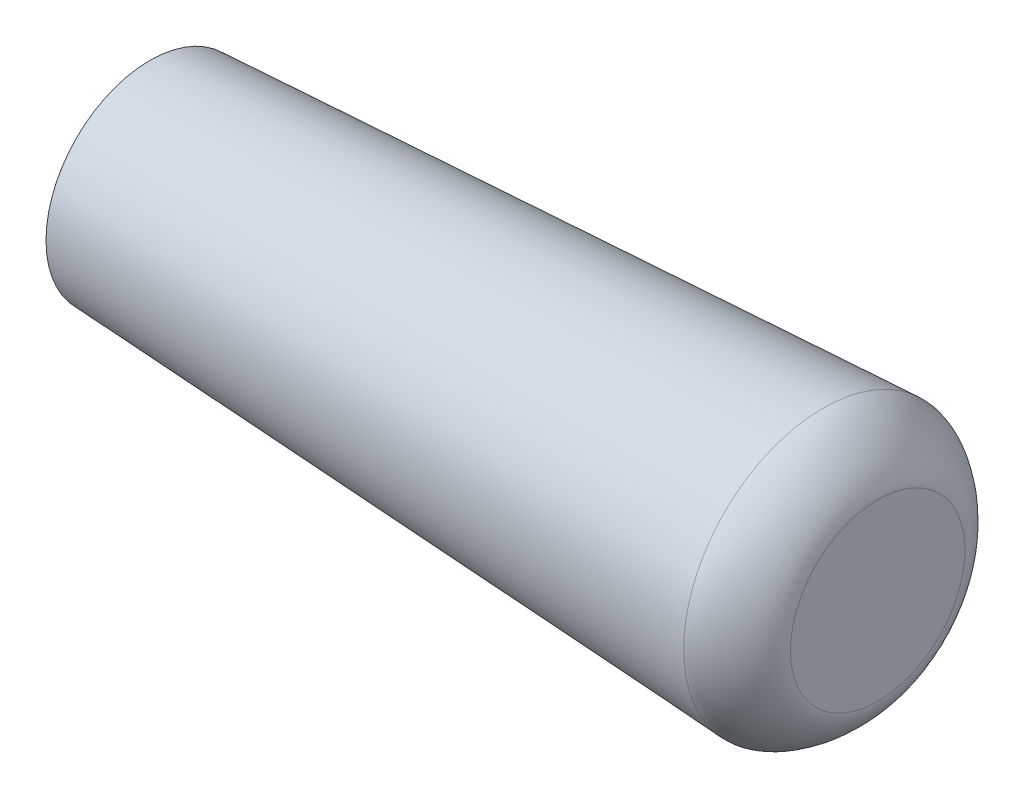
ISO-10303-21;
HEADER;
FILE_DESCRIPTION(('STEP AP214'),'2;1');
FILE_NAME('part.step','',(''),(''),'','','');
FILE_SCHEMA(('AUTOMOTIVE_DESIGN { 1 0 10303 214 1 1 1 1 }'));
ENDSEC;
DATA;
#1=APPLICATION_CONTEXT('core data for automotive mechanical design processes');
#2=APPLICATION_PROTOCOL_DEFINITION('international standard','automotive_design',2000,#1);
#3=PRODUCT_CONTEXT('',#1,'mechanical');
#4=PRODUCT('Part','Part','',(#3));
#5=PRODUCT_RELATED_PRODUCT_CATEGORY('part','',(#4));
#6=PRODUCT_DEFINITION_FORMATION('','',#4);
#7=PRODUCT_DEFINITION_CONTEXT('part definition',#1,'design');
#8=PRODUCT_DEFINITION('design','',#6,#7);
#9=PRODUCT_DEFINITION_SHAPE('','',#8);
#10=(LENGTH_UNIT() NAMED_UNIT(*) SI_UNIT(.MILLI.,.METRE.));
#11=(NAMED_UNIT(*) PLANE_ANGLE_UNIT() SI_UNIT($,.RADIAN.));
#12=(NAMED_UNIT(*) SI_UNIT($,.STERADIAN.) SOLID_ANGLE_UNIT());
#13=UNCERTAINTY_MEASURE_WITH_UNIT(LENGTH_MEASURE(1.E-05),#10,'distance_accuracy_value','');
#14=(GEOMETRIC_REPRESENTATION_CONTEXT(3) GLOBAL_UNCERTAINTY_ASSIGNED_CONTEXT((#13)) GLOBAL_UNIT_ASSIGNED_CONTEXT((#10,
#11,#12)) REPRESENTATION_CONTEXT('',''));
#15=CARTESIAN_POINT('',(0.,0.,0.));
#16=DIRECTION('',(0.,0.,1.));
#17=DIRECTION('',(1.,0.,0.));
#18=AXIS2_PLACEMENT_3D('',#15,#16,#17);
#19=CARTESIAN_POINT('',(0.,0.,0.));
#20=DIRECTION('',(1.,0.,0.));
#21=DIRECTION('',(0.,0.,1.));
#22=AXIS2_PLACEMENT_3D('',#19,#20,#21);
#23=CONICAL_SURFACE('',#22,10.,0.05235987755983);
#24=CARTESIAN_POINT('',(64.7383202187853,0.,13.3927915971809));
#25=CARTESIAN_POINT('',(64.7383202187853,-1.75311231639023,13.3927915971809));
#26=CARTESIAN_POINT('',(64.7383202187853,-3.50553487005225,13.0442130783827));
#27=CARTESIAN_POINT('',(64.7383202187853,-6.74486404466686,11.7024390012665));
#28=CARTESIAN_POINT('',(64.7383202187853,-8.23049615028417,10.7097713644856));
#29=CARTESIAN_POINT('',(64.7383202187853,-10.7097713644856,8.2304961502841));
#30=CARTESIAN_POINT('',(64.7383202187852,-11.7024390012669,6.74486404466601));
#31=CARTESIAN_POINT('',(64.7383202187853,-13.0442130783824,3.50553487005303));
#32=CARTESIAN_POINT('',(64.7383202187853,-13.3927915971809,1.75311231639051));
#33=CARTESIAN_POINT('',(64.7383202187853,-13.392791597181,-1.75311231639046));
#34=CARTESIAN_POINT('',(64.7383202187852,-13.0442130783824,-3.50553487005293));
#35=CARTESIAN_POINT('',(64.7383202187853,-11.7024390012668,-6.74486404466618));
#36=CARTESIAN_POINT('',(64.7383202187853,-10.7097713644862,-8.23049615028351));
#37=CARTESIAN_POINT('',(64.7383202187852,-8.23049615028352,-10.7097713644862));
#38=CARTESIAN_POINT('',(64.7383202187852,-6.74486404466627,-11.7024390012668));
#39=CARTESIAN_POINT('',(64.7383202187853,-3.50553487005277,-13.0442130783825));
#40=CARTESIAN_POINT('',(64.7383202187853,-1.75311231639048,-13.3927915971809));
#41=CARTESIAN_POINT('',(64.7383202187853,1.75311231639048,-13.3927915971809));
#42=CARTESIAN_POINT('',(64.7383202187853,3.50553487005314,-13.0442130783824));
#43=CARTESIAN_POINT('',(64.7383202187853,6.74486404466597,-11.7024390012669));
#44=CARTESIAN_POINT('',(64.7383202187852,8.23049615028302,-10.7097713644867));
#45=CARTESIAN_POINT('',(64.7383202187853,10.7097713644867,-8.23049615028305));
#46=CARTESIAN_POINT('',(64.7383202187853,11.7024390012669,-6.74486404466586));
#47=CARTESIAN_POINT('',(64.7383202187853,13.0442130783823,-3.50553487005322));
#48=CARTESIAN_POINT('',(64.7383202187853,13.3927915971809,-1.75311231639048));
#49=CARTESIAN_POINT('',(64.7383202187853,13.3927915971809,1.75311231639048));
#50=CARTESIAN_POINT('',(64.7383202187853,13.0442130783825,3.50553487005281));
#51=CARTESIAN_POINT('',(64.7383202187853,11.7024390012668,6.74486404466626));
#52=CARTESIAN_POINT('',(64.7383202187853,10.7097713644864,8.23049615028331));
#53=CARTESIAN_POINT('',(64.7383202187852,8.23049615028331,10.7097713644864));
#54=CARTESIAN_POINT('',(64.7383202187854,6.74486404466599,11.7024390012669));
#55=CARTESIAN_POINT('',(64.7383202187852,3.50553487005309,13.0442130783824));
#56=CARTESIAN_POINT('',(64.7383202187853,1.75311231639022,13.3927915971809));
#57=CARTESIAN_POINT('',(64.7383202187853,0.,13.3927915971809));
#58=(BOUNDED_CURVE() B_SPLINE_CURVE(3,(#24,#25,#26,#27,#28,#29,#30,#31,#32,#33,#34,#35,#36,#37,
#38,#39,#40,#41,#42,#43,#44,#45,#46,#47,#48,#49,#50,#51,#52,#53,#54,#55,#56,#57),.UNSPECIFIED.,
.T.,.F.) B_SPLINE_CURVE_WITH_KNOTS((4,2,2,2,2,2,2,2,2,2,2,2,2,2,2,2,4),(0.,0.392699081698725,
0.785398163397448,1.17809724509617,1.5707963267949,1.96349540849362,2.35619449019234,
2.74889357189107,3.14159265358979,3.53429173528852,3.92699081698724,4.31968989868597,
4.71238898038469,5.10508806208341,5.49778714378214,5.89048622548086,6.28318530717959),
.UNSPECIFIED.) CURVE() GEOMETRIC_REPRESENTATION_ITEM() RATIONAL_B_SPLINE_CURVE((0.999999999999998,
0.999999999999998,0.999999999999998,0.999999999999998,0.999999999999998,0.999999999999998,
0.999999999999998,0.999999999999998,0.999999999999998,0.999999999999998,0.999999999999998,
0.999999999999998,0.999999999999998,0.999999999999998,0.999999999999998,0.999999999999998,
0.999999999999998,0.999999999999998,0.999999999999998,0.999999999999998,0.999999999999998,
0.999999999999998,0.999999999999998,0.999999999999998,0.999999999999998,0.999999999999998,
0.999999999999998,0.999999999999998,0.999999999999998,0.999999999999998,0.999999999999998,
0.999999999999998,0.999999999999998,0.999999999999998)) REPRESENTATION_ITEM(''));
#59=CARTESIAN_POINT('',(64.7383202187853,0.,13.3927915971809));
#60=VERTEX_POINT('',#59);
#61=EDGE_CURVE('E12',#60,#60,#58,.T.);
#62=ORIENTED_EDGE('',*,*,#61,.F.);
#63=EDGE_LOOP('',(#62));
#64=FACE_BOUND('',#63,.T.);
#65=CARTESIAN_POINT('',(0.,0.,0.));
#66=DIRECTION('',(-1.,0.,0.));
#67=DIRECTION('',(0.,0.,1.));
#68=AXIS2_PLACEMENT_3D('',#65,#66,#67);
#69=CIRCLE('',#68,10.);
#70=CARTESIAN_POINT('',(0.,0.,10.));
#71=VERTEX_POINT('',#70);
#72=EDGE_CURVE('E114',#71,#71,#69,.T.);
#73=ORIENTED_EDGE('',*,*,#72,.F.);
#74=EDGE_LOOP('',(#73));
#75=FACE_BOUND('',#74,.T.);
#76=ADVANCED_FACE('F40',(#64,#75),#23,.T.);
#77=CARTESIAN_POINT('',(70.,0.,0.));
#78=DIRECTION('',(1.,0.,0.));
#79=DIRECTION('',(0.,0.,1.));
#80=AXIS2_PLACEMENT_3D('',#77,#78,#79);
#81=PLANE('',#80);
#82=CARTESIAN_POINT('',(70.,0.,8.39964392340808));
#83=CARTESIAN_POINT('',(70.,0.137435809831807,8.3996441457771));
#84=CARTESIAN_POINT('',(70.,0.274868870852457,8.39622814788783));
#85=CARTESIAN_POINT('',(70.,0.549397911011147,8.38262851954588));
#86=CARTESIAN_POINT('',(70.,0.686493895561294,8.3724449984744));
#87=CARTESIAN_POINT('',(70.,0.960024129648364,8.34537488336716));
#88=CARTESIAN_POINT('',(70.,1.09645836720264,8.32848816840796));
#89=CARTESIAN_POINT('',(70.,1.36834237689593,8.2880761814516));
#90=CARTESIAN_POINT('',(70.,1.50379213160251,8.26455079219447));
#91=CARTESIAN_POINT('',(70.,1.7733838936348,8.21092566212976));
#92=CARTESIAN_POINT('',(70.,1.90752590096051,8.18082592132217));
#93=CARTESIAN_POINT('',(70.,2.17417901936719,8.11411619101772));
#94=CARTESIAN_POINT('',(70.,2.30669015921437,8.07750631652697));
#95=CARTESIAN_POINT('',(70.,2.56975823142954,7.99784046985379));
#96=CARTESIAN_POINT('',(70.,2.70031519900863,7.95478461397196));
#97=CARTESIAN_POINT('',(70.,2.95915205255988,7.86229088127508));
#98=CARTESIAN_POINT('',(70.,3.08743190169454,7.81285290132167));
#99=CARTESIAN_POINT('',(70.,3.34137723281421,7.70766530111738));
#100=CARTESIAN_POINT('',(70.,3.46704271479922,7.6519156808665));
#101=CARTESIAN_POINT('',(70.,3.71547095494232,7.5342933318498));
#102=CARTESIAN_POINT('',(70.,3.83823375998218,7.47242070206187));
#103=CARTESIAN_POINT('',(70.,4.08058323746257,7.34273574564432));
#104=CARTESIAN_POINT('',(70.,4.20016985256415,7.27492331187979));
#105=CARTESIAN_POINT('',(70.,4.43589298614747,7.13354198276467));
#106=CARTESIAN_POINT('',(70.,4.55202944364848,7.05997298575159));
#107=CARTESIAN_POINT('',(70.,4.78057828989615,6.90726152896813));
#108=CARTESIAN_POINT('',(70.,4.89299067864281,6.82811906919775));
#109=CARTESIAN_POINT('',(70.,5.11381733273933,6.66444358303719));
#110=CARTESIAN_POINT('',(70.,5.22223166867676,6.5799106518904));
#111=CARTESIAN_POINT('',(70.,5.43478807545815,6.40563721418535));
#112=CARTESIAN_POINT('',(70.,5.53893022333921,6.31589680160012));
#113=CARTESIAN_POINT('',(70.,5.74266847580178,6.13139115945657));
#114=CARTESIAN_POINT('',(70.,5.84226450688053,6.03662584870793));
#115=CARTESIAN_POINT('',(70.,6.03662584870793,5.84226450688054));
#116=CARTESIAN_POINT('',(70.,6.13139115945656,5.74266847580178));
#117=CARTESIAN_POINT('',(70.,6.3158968016001,5.5389302233392));
#118=CARTESIAN_POINT('',(70.,6.40563721418532,5.43478807545814));
#119=CARTESIAN_POINT('',(70.,6.57991065189037,5.22223166867678));
#120=CARTESIAN_POINT('',(70.,6.66444358303715,5.11381733273938));
#121=CARTESIAN_POINT('',(70.,6.82811906919769,4.89299067864275));
#122=CARTESIAN_POINT('',(70.,6.90726152896804,4.78057828989593));
#123=CARTESIAN_POINT('',(70.,7.05997298575154,4.55202944364869));
#124=CARTESIAN_POINT('',(70.,7.1335419827647,4.43589298614827));
#125=CARTESIAN_POINT('',(70.,7.27492331187959,4.20016985256333));
#126=CARTESIAN_POINT('',(70.,7.34273574564381,4.08058323745954));
#127=CARTESIAN_POINT('',(70.,7.47242070206222,3.8382337599852));
#128=CARTESIAN_POINT('',(70.,7.53429333185132,3.71547095495361));
#129=CARTESIAN_POINT('',(70.,7.65191568086488,3.46704271478792));
#130=CARTESIAN_POINT('',(70.,7.70766530111145,3.34137723277203));
#131=CARTESIAN_POINT('',(70.,7.8128529013276,3.08743190173671));
#132=CARTESIAN_POINT('',(70.,7.86229088129717,2.95915205271727));
#133=CARTESIAN_POINT('',(70.,7.95478461394999,2.70031519885127));
#134=CARTESIAN_POINT('',(70.,7.99784046977158,2.56975823084222));
#135=CARTESIAN_POINT('',(70.,8.07750631660936,2.30669015980175));
#136=CARTESIAN_POINT('',(70.,8.11411619132496,2.17417902155926));
#137=CARTESIAN_POINT('',(70.,8.18082592101511,1.90752589876849));
#138=CARTESIAN_POINT('',(70.,8.21092566098354,1.77338388545386));
#139=CARTESIAN_POINT('',(70.,8.26455079334083,1.50379213978357));
#140=CARTESIAN_POINT('',(70.,8.28807618572969,1.36834240742791));
#141=CARTESIAN_POINT('',(70.,8.32848816413004,1.09645833667133));
#142=CARTESIAN_POINT('',(70.,8.34537486740175,0.960024015704698));
#143=CARTESIAN_POINT('',(70.,8.37244501443957,0.686494009503035));
#144=CARTESIAN_POINT('',(70.,8.38262857912812,0.549398336243527));
#145=CARTESIAN_POINT('',(70.,8.39622808830464,0.27486844561329));
#146=CARTESIAN_POINT('',(70.,8.39964392340808,0.137434222806645));
#147=CARTESIAN_POINT('',(70.,8.39964392340808,-0.137434222806648));
#148=CARTESIAN_POINT('',(70.,8.39622808830464,-0.274868445613296));
#149=CARTESIAN_POINT('',(70.,8.38262857912812,-0.549398336243544));
#150=CARTESIAN_POINT('',(70.,8.37244501443957,-0.68649400950306));
#151=CARTESIAN_POINT('',(70.,8.34537486740175,-0.96002401570474));
#152=CARTESIAN_POINT('',(70.,8.32848816413004,-1.09645833667138));
#153=CARTESIAN_POINT('',(70.,8.28807618572969,-1.36834240742798));
#154=CARTESIAN_POINT('',(70.,8.26455079334083,-1.50379213978365));
#155=CARTESIAN_POINT('',(70.,8.21092566098354,-1.77338388545395));
#156=CARTESIAN_POINT('',(70.,8.18082592101511,-1.90752589876858));
#157=CARTESIAN_POINT('',(70.,8.11411619132495,-2.17417902155936));
#158=CARTESIAN_POINT('',(70.,8.07750631660936,-2.30669015980186));
#159=CARTESIAN_POINT('',(70.,7.99784046977158,-2.56975823084232));
#160=CARTESIAN_POINT('',(70.,7.95478461394998,-2.70031519885136));
#161=CARTESIAN_POINT('',(70.,7.86229088129717,-2.95915205271732));
#162=CARTESIAN_POINT('',(70.,7.8128529013276,-3.08743190173674));
#163=CARTESIAN_POINT('',(70.,7.70766530111145,-3.34137723277202));
#164=CARTESIAN_POINT('',(70.,7.65191568086488,-3.46704271478788));
#165=CARTESIAN_POINT('',(70.,7.53429333185133,-3.71547095495355));
#166=CARTESIAN_POINT('',(70.,7.47242070206223,-3.83823375998514));
#167=CARTESIAN_POINT('',(70.,7.34273574564385,-4.08058323745949));
#168=CARTESIAN_POINT('',(70.,7.27492331187964,-4.20016985256329));
#169=CARTESIAN_POINT('',(70.,7.13354198276477,-4.43589298614825));
#170=CARTESIAN_POINT('',(70.,7.05997298575162,-4.55202944364868));
#171=CARTESIAN_POINT('',(70.,6.90726152896813,-4.78057828989595));
#172=CARTESIAN_POINT('',(70.,6.82811906919778,-4.89299067864279));
#173=CARTESIAN_POINT('',(70.,6.66444358303725,-5.11381733273944));
#174=CARTESIAN_POINT('',(70.,6.57991065189047,-5.22223166867684));
#175=CARTESIAN_POINT('',(70.,6.40563721418542,-5.43478807545821));
#176=CARTESIAN_POINT('',(70.,6.31589680160019,-5.53893022333927));
#177=CARTESIAN_POINT('',(70.,6.13139115945661,-5.74266847580183));
#178=CARTESIAN_POINT('',(70.,6.03662584870795,-5.84226450688056));
#179=CARTESIAN_POINT('',(70.,5.84226450688051,-6.0366258487079));
#180=CARTESIAN_POINT('',(70.,5.74266847580173,-6.13139115945652));
#181=CARTESIAN_POINT('',(70.,5.5389302233391,-6.31589680160002));
#182=CARTESIAN_POINT('',(70.,5.43478807545802,-6.40563721418521));
#183=CARTESIAN_POINT('',(70.,5.22223166867663,-6.57991065189023));
#184=CARTESIAN_POINT('',(70.,5.11381733273923,-6.66444358303701));
#185=CARTESIAN_POINT('',(70.,4.89299067864259,-6.82811906919753));
#186=CARTESIAN_POINT('',(70.,4.78057828989576,-6.90726152896788));
#187=CARTESIAN_POINT('',(70.,4.55202944364853,-7.05997298575139));
#188=CARTESIAN_POINT('',(70.,4.43589298614812,-7.13354198276455));
#189=CARTESIAN_POINT('',(70.,4.20016985256319,-7.27492331187945));
#190=CARTESIAN_POINT('',(70.,4.08058323745941,-7.34273574564369));
#191=CARTESIAN_POINT('',(70.,3.8382337599851,-7.47242070206211));
#192=CARTESIAN_POINT('',(70.,3.71547095495353,-7.53429333185123));
#193=CARTESIAN_POINT('',(70.,3.46704271478788,-7.65191568086483));
#194=CARTESIAN_POINT('',(70.,3.34137723277202,-7.70766530111143));
#195=CARTESIAN_POINT('',(70.,3.08743190173675,-7.81285290132761));
#196=CARTESIAN_POINT('',(70.,2.95915205271733,-7.8622908812972));
#197=CARTESIAN_POINT('',(70.,2.70031519885136,-7.95478461395004));
#198=CARTESIAN_POINT('',(70.,2.56975823084233,-7.99784046977164));
#199=CARTESIAN_POINT('',(70.,2.30669015980186,-8.07750631660943));
#200=CARTESIAN_POINT('',(70.,2.17417902155937,-8.11411619132503));
#201=CARTESIAN_POINT('',(70.,1.90752589876858,-8.18082592101518));
#202=CARTESIAN_POINT('',(70.,1.77338388545395,-8.21092566098361));
#203=CARTESIAN_POINT('',(70.,1.50379213978365,-8.26455079334089));
#204=CARTESIAN_POINT('',(70.,1.36834240742798,-8.28807618572974));
#205=CARTESIAN_POINT('',(70.,1.09645833667138,-8.32848816413008));
#206=CARTESIAN_POINT('',(70.,0.96002401570474,-8.34537486740178));
#207=CARTESIAN_POINT('',(70.,0.686494009503061,-8.37244501443959));
#208=CARTESIAN_POINT('',(70.,0.549398336243545,-8.38262857912814));
#209=CARTESIAN_POINT('',(70.,0.274868445613297,-8.39622808830464));
#210=CARTESIAN_POINT('',(70.,0.137434222806649,-8.39964392340808));
#211=CARTESIAN_POINT('',(70.,-0.137434222806643,-8.39964392340808));
#212=CARTESIAN_POINT('',(70.,-0.274868445613288,-8.39622808830464));
#213=CARTESIAN_POINT('',(70.,-0.549398336243524,-8.38262857912814));
#214=CARTESIAN_POINT('',(70.,-0.686494009503031,-8.37244501443959));
#215=CARTESIAN_POINT('',(70.,-0.960024015704691,-8.34537486740178));
#216=CARTESIAN_POINT('',(70.,-1.09645833667132,-8.32848816413009));
#217=CARTESIAN_POINT('',(70.,-1.3683424074279,-8.28807618572975));
#218=CARTESIAN_POINT('',(70.,-1.50379213978356,-8.2645507933409));
#219=CARTESIAN_POINT('',(70.,-1.77338388545384,-8.21092566098361));
#220=CARTESIAN_POINT('',(70.,-1.90752589876847,-8.18082592101518));
#221=CARTESIAN_POINT('',(70.,-2.17417902155924,-8.11411619132503));
#222=CARTESIAN_POINT('',(70.,-2.30669015980174,-8.07750631660944));
#223=CARTESIAN_POINT('',(70.,-2.56975823084222,-7.99784046977165));
#224=CARTESIAN_POINT('',(70.,-2.70031519885126,-7.95478461395004));
#225=CARTESIAN_POINT('',(70.,-2.95915205271726,-7.86229088129721));
#226=CARTESIAN_POINT('',(70.,-3.0874319017367,-7.81285290132762));
#227=CARTESIAN_POINT('',(70.,-3.34137723277203,-7.70766530111144));
#228=CARTESIAN_POINT('',(70.,-3.46704271478791,-7.65191568086485));
#229=CARTESIAN_POINT('',(70.,-3.71547095495362,-7.53429333185127));
#230=CARTESIAN_POINT('',(70.,-3.83823375998522,-7.47242070206217));
#231=CARTESIAN_POINT('',(70.,-4.08058323745958,-7.34273574564378));
#232=CARTESIAN_POINT('',(70.,-4.20016985256339,-7.27492331187957));
#233=CARTESIAN_POINT('',(70.,-4.43589298614835,-7.1335419827647));
#234=CARTESIAN_POINT('',(70.,-4.55202944364877,-7.05997298575156));
#235=CARTESIAN_POINT('',(70.,-4.78057828989603,-6.90726152896807));
#236=CARTESIAN_POINT('',(70.,-4.89299067864286,-6.82811906919773));
#237=CARTESIAN_POINT('',(70.,-5.11381733273949,-6.66444358303722));
#238=CARTESIAN_POINT('',(70.,-5.22223166867689,-6.57991065189044));
#239=CARTESIAN_POINT('',(70.,-5.43478807545824,-6.4056372141854));
#240=CARTESIAN_POINT('',(70.,-5.53893022333929,-6.31589680160018));
#241=CARTESIAN_POINT('',(70.,-5.74266847580184,-6.13139115945661));
#242=CARTESIAN_POINT('',(70.,-5.84226450688057,-6.03662584870794));
#243=CARTESIAN_POINT('',(70.,-6.03662584870791,-5.8422645068805));
#244=CARTESIAN_POINT('',(70.,-6.13139115945652,-5.74266847580173));
#245=CARTESIAN_POINT('',(70.,-6.31589680160003,-5.53893022333913));
#246=CARTESIAN_POINT('',(70.,-6.40563721418525,-5.43478807545806));
#247=CARTESIAN_POINT('',(70.,-6.57991065189029,-5.22223166867671));
#248=CARTESIAN_POINT('',(70.,-6.66444358303708,-5.11381733273933));
#249=CARTESIAN_POINT('',(70.,-6.82811906919763,-4.89299067864272));
#250=CARTESIAN_POINT('',(70.,-6.90726152896799,-4.78057828989591));
#251=CARTESIAN_POINT('',(70.,-7.05997298575153,-4.55202944364871));
#252=CARTESIAN_POINT('',(70.,-7.1335419827647,-4.43589298614831));
#253=CARTESIAN_POINT('',(70.,-7.27492331187961,-4.20016985256339));
#254=CARTESIAN_POINT('',(70.,-7.34273574564384,-4.0805832374596));
#255=CARTESIAN_POINT('',(70.,-7.47242070206225,-3.83823375998527));
#256=CARTESIAN_POINT('',(70.,-7.53429333185136,-3.71547095495368));
#257=CARTESIAN_POINT('',(70.,-7.65191568086491,-3.46704271478797));
#258=CARTESIAN_POINT('',(70.,-7.70766530111147,-3.34137723277207));
#259=CARTESIAN_POINT('',(70.,-7.81285290132758,-3.0874319017367));
#260=CARTESIAN_POINT('',(70.,-7.86229088129713,-2.95915205271724));
#261=CARTESIAN_POINT('',(70.,-7.95478461394991,-2.7003151988512));
#262=CARTESIAN_POINT('',(70.,-7.9978404697715,-2.56975823084215));
#263=CARTESIAN_POINT('',(70.,-8.07750631660928,-2.30669015980166));
#264=CARTESIAN_POINT('',(70.,-8.11411619132488,-2.17417902155916));
#265=CARTESIAN_POINT('',(70.,-8.18082592101503,-1.90752589876839));
#266=CARTESIAN_POINT('',(70.,-8.21092566098347,-1.77338388545376));
#267=CARTESIAN_POINT('',(70.,-8.26455079334077,-1.50379213978349));
#268=CARTESIAN_POINT('',(70.,-8.28807618572964,-1.36834240742784));
#269=CARTESIAN_POINT('',(70.,-8.32848816413001,-1.09645833667127));
#270=CARTESIAN_POINT('',(70.,-8.34537486740172,-0.960024015704647));
#271=CARTESIAN_POINT('',(70.,-8.37244501443956,-0.686494009503));
#272=CARTESIAN_POINT('',(70.,-8.38262857912811,-0.549398336243498));
#273=CARTESIAN_POINT('',(70.,-8.39622808830464,-0.274868445613271));
#274=CARTESIAN_POINT('',(70.,-8.39964392340808,-0.137434222806629));
#275=CARTESIAN_POINT('',(70.,-8.39964392340808,0.137434222806661));
#276=CARTESIAN_POINT('',(70.,-8.39622808830464,0.274868445613309));
#277=CARTESIAN_POINT('',(70.,-8.38262857912814,0.549398336243556));
#278=CARTESIAN_POINT('',(70.,-8.3724450144396,0.686494009503071));
#279=CARTESIAN_POINT('',(70.,-8.34537486740181,0.960024015704749));
#280=CARTESIAN_POINT('',(70.,-8.32848816413012,1.09645833667139));
#281=CARTESIAN_POINT('',(70.,-8.28807618572979,1.36834240742799));
#282=CARTESIAN_POINT('',(70.,-8.26455079334094,1.50379213978365));
#283=CARTESIAN_POINT('',(70.,-8.21092566098367,1.77338388545395));
#284=CARTESIAN_POINT('',(70.,-8.18082592101524,1.90752589876858));
#285=CARTESIAN_POINT('',(70.,-8.1141161913251,2.17417902155936));
#286=CARTESIAN_POINT('',(70.,-8.0775063166095,2.30669015980186));
#287=CARTESIAN_POINT('',(70.,-7.99784046977171,2.56975823084232));
#288=CARTESIAN_POINT('',(70.,-7.9547846139501,2.70031519885135));
#289=CARTESIAN_POINT('',(70.,-7.86229088129724,2.95915205271731));
#290=CARTESIAN_POINT('',(70.,-7.81285290132764,3.08743190173673));
#291=CARTESIAN_POINT('',(70.,-7.70766530111142,3.34137723277201));
#292=CARTESIAN_POINT('',(70.,-7.65191568086481,3.46704271478787));
#293=CARTESIAN_POINT('',(70.,-7.53429333185119,3.71547095495356));
#294=CARTESIAN_POINT('',(70.,-7.47242070206207,3.83823375998516));
#295=CARTESIAN_POINT('',(70.,-7.34273574564364,4.08058323745954));
#296=CARTESIAN_POINT('',(70.,-7.27492331187941,4.20016985256336));
#297=CARTESIAN_POINT('',(70.,-7.13354198276452,4.43589298614836));
#298=CARTESIAN_POINT('',(70.,-7.05997298575136,4.55202944364881));
#299=CARTESIAN_POINT('',(70.,-6.90726152896786,4.7805782898961));
#300=CARTESIAN_POINT('',(70.,-6.82811906919752,4.89299067864295));
#301=CARTESIAN_POINT('',(70.,-6.66444358303701,5.11381733273961));
#302=CARTESIAN_POINT('',(70.,-6.57991065189024,5.22223166867701));
#303=CARTESIAN_POINT('',(70.,-6.40563721418524,5.43478807545835));
#304=CARTESIAN_POINT('',(70.,-6.31589680160004,5.5389302233394));
#305=CARTESIAN_POINT('',(70.,-6.13139115945654,5.74266847580189));
#306=CARTESIAN_POINT('',(70.,-6.03662584870793,5.84226450688058));
#307=CARTESIAN_POINT('',(70.,-5.84226450688057,6.03662584870784));
#308=CARTESIAN_POINT('',(70.,-5.74266847580183,6.13139115945641));
#309=CARTESIAN_POINT('',(70.,-5.5389302233393,6.31589680159987));
#310=CARTESIAN_POINT('',(70.,-5.43478807545826,6.40563721418506));
#311=CARTESIAN_POINT('',(70.,-5.2222316686769,6.57991065189008));
#312=CARTESIAN_POINT('',(70.,-5.11381733273948,6.66444358303687));
#313=CARTESIAN_POINT('',(70.,-4.89299067864298,6.82811906919744));
#314=CARTESIAN_POINT('',(70.,-4.78057828989632,6.90726152896784));
#315=CARTESIAN_POINT('',(70.,-4.55202944364865,7.05997298575134));
#316=CARTESIAN_POINT('',(70.,-4.43589298614764,7.13354198276445));
#317=CARTESIAN_POINT('',(70.,-4.20016985256431,7.27492331187962));
#318=CARTESIAN_POINT('',(70.,-4.08058323746272,7.34273574564418));
#319=CARTESIAN_POINT('',(70.,-3.8382337599823,7.47242070206178));
#320=CARTESIAN_POINT('',(70.,-3.71547095494242,7.53429333184974));
#321=CARTESIAN_POINT('',(70.,-3.46704271479928,7.65191568086648));
#322=CARTESIAN_POINT('',(70.,-3.34137723281424,7.70766530111737));
#323=CARTESIAN_POINT('',(70.,-3.08743190169453,7.81285290132167));
#324=CARTESIAN_POINT('',(70.,-2.95915205255985,7.86229088127508));
#325=CARTESIAN_POINT('',(70.,-2.70031519900857,7.95478461397196));
#326=CARTESIAN_POINT('',(70.,-2.56975823142947,7.9978404698538));
#327=CARTESIAN_POINT('',(70.,-2.30669015921429,8.07750631652698));
#328=CARTESIAN_POINT('',(70.,-2.17417901936709,8.11411619101773));
#329=CARTESIAN_POINT('',(70.,-1.90752590096042,8.18082592132218));
#330=CARTESIAN_POINT('',(70.,-1.77338389363471,8.21092566212977));
#331=CARTESIAN_POINT('',(70.,-1.50379213160243,8.26455079219448));
#332=CARTESIAN_POINT('',(70.,-1.36834237689586,8.2880761814516));
#333=CARTESIAN_POINT('',(70.,-1.09645836720259,8.32848816840797));
#334=CARTESIAN_POINT('',(70.,-0.960024129648323,8.34537488336716));
#335=CARTESIAN_POINT('',(70.,-0.686493895561272,8.3724449984744));
#336=CARTESIAN_POINT('',(70.,-0.549397911011132,8.38262851954588));
#337=CARTESIAN_POINT('',(70.,-0.274868870852451,8.39622814788783));
#338=CARTESIAN_POINT('',(70.,-0.137435809831803,8.3996441457771));
#339=CARTESIAN_POINT('',(70.,0.,8.39964392340808));
#340=B_SPLINE_CURVE_WITH_KNOTS('',3,(#82,#83,#84,#85,#86,#87,#88,#89,#90,#91,#92,#93,#94,#95,
#96,#97,#98,#99,#100,#101,#102,#103,#104,#105,#106,#107,#108,#109,#110,#111,#112,#113,#114,#115,
#116,#117,#118,#119,#120,#121,#122,#123,#124,#125,#126,#127,#128,#129,#130,#131,#132,#133,#134,
#135,#136,#137,#138,#139,#140,#141,#142,#143,#144,#145,#146,#147,#148,#149,#150,#151,#152,#153,
#154,#155,#156,#157,#158,#159,#160,#161,#162,#163,#164,#165,#166,#167,#168,#169,#170,#171,#172,
#173,#174,#175,#176,#177,#178,#179,#180,#181,#182,#183,#184,#185,#186,#187,#188,#189,#190,#191,
#192,#193,#194,#195,#196,#197,#198,#199,#200,#201,#202,#203,#204,#205,#206,#207,#208,#209,#210,
#211,#212,#213,#214,#215,#216,#217,#218,#219,#220,#221,#222,#223,#224,#225,#226,#227,#228,#229,
#230,#231,#232,#233,#234,#235,#236,#237,#238,#239,#240,#241,#242,#243,#244,#245,#246,#247,#248,
#249,#250,#251,#252,#253,#254,#255,#256,#257,#258,#259,#260,#261,#262,#263,#264,#265,#266,#267,
#268,#269,#270,#271,#272,#273,#274,#275,#276,#277,#278,#279,#280,#281,#282,#283,#284,#285,#286,
#287,#288,#289,#290,#291,#292,#293,#294,#295,#296,#297,#298,#299,#300,#301,#302,#303,#304,#305,
#306,#307,#308,#309,#310,#311,#312,#313,#314,#315,#316,#317,#318,#319,#320,#321,#322,#323,#324,
#325,#326,#327,#328,#329,#330,#331,#332,#333,#334,#335,#336,#337,#338,#339),.UNSPECIFIED.,.F.,
.F.,(4,2,2,2,2,2,2,2,2,2,2,2,2,2,2,2,2,2,2,2,2,2,2,2,2,2,2,2,2,2,2,2,2,2,2,2,2,2,2,2,2,2,2,2,2,
2,2,2,2,2,2,2,2,2,2,2,2,2,2,2,2,2,2,2,2,2,2,2,2,2,2,2,2,2,2,2,2,2,2,2,2,2,2,2,2,2,2,2,2,2,2,2,2,
2,2,2,2,2,2,2,2,2,2,2,2,2,2,2,2,2,2,2,2,2,2,2,2,2,2,2,2,2,2,2,2,2,2,2,4),(0.,0.412261089172174,
0.824515515269929,1.23677737864089,1.64904652431402,2.06131566998717,2.47357753335814,
2.88583195945594,3.29809304862817,3.71035413780038,4.12260856389814,4.53487042726907,
4.94713957294219,5.35940871861531,5.77167058198629,6.1839250080841,6.59618609725638,
7.00844718642866,7.42070161252647,7.83296347589743,8.24523262157054,8.65750176724365,
9.06976363061458,9.48201805671235,9.89427914588459,10.3065402350568,10.7187946611546,
11.1310565245256,11.5433256701987,11.9555948158718,12.3678566792428,12.7801111053406,
13.1923721945128,13.604633283685,14.0168877097828,14.4291495731538,14.8414187188269,
15.2536878645001,15.665949727871,16.0782041539688,16.490465243141,16.9027263323132,
17.3149807584109,17.7272426217818,18.139511767455,18.5517809131281,18.9640427764991,
19.3762972025969,19.7885582917692,20.2008193809415,20.6130738070393,21.0253356704103,
21.4376048160834,21.8498739617565,22.2621358251274,22.6743902512251,23.0866513403973,
23.4989124295695,23.9111668556673,24.3234287190383,24.7356978647114,25.1479670103845,
25.5602288737555,25.9724832998533,26.3847443890255,26.7970054781978,27.2092599042955,
27.6215217676665,28.0337909133396,28.4460600590127,28.8583219223837,29.2705763484815,
29.6828374376537,30.095098526826,30.5073529529238,30.9196148162947,31.3318839619679,
31.744153107641,32.1564149710119,32.5686693971097,32.980930486282,33.3931915754543,
33.8054460015521,34.217707864923,34.6299770105961,35.0422461562692,35.4545080196401,
35.8667624457379,36.2790235349101,36.6912846240824,37.1035390501802,37.5158009135512,
37.9280700592243,38.3403392048974,38.7526010682684,39.1648554943661,39.5771165835383,
39.9893776727106,40.4016320988084,40.8138939621793,41.2261631078525,41.6384322535256,
42.0506941168966,42.4629485429943,42.8752096321665,43.2874707213388,43.6997251474366,
44.1119870108076,44.5242561564808,44.936525302154,45.3487871655249,45.7610415916226,
46.1733026807947,46.5855637699668,46.9978181960645,47.4100800594355,47.8223492051086,
48.2346183507818,48.6468802141528,49.0591346402506,49.4713957294229,49.8836568185952,
50.295911244693,50.708173108064,51.1204422537372,51.5327113994103,51.9449732627812,
52.3572276888789,52.7694887780511),.UNSPECIFIED.);
#341=CARTESIAN_POINT('',(70.,0.,8.39964392340808));
#342=VERTEX_POINT('',#341);
#343=EDGE_CURVE('E53',#342,#342,#340,.T.);
#344=ORIENTED_EDGE('',*,*,#343,.F.);
#345=EDGE_LOOP('',(#344));
#346=FACE_BOUND('',#345,.T.);
#347=ADVANCED_FACE('F127',(#346),#81,.T.);
#348=CARTESIAN_POINT('',(0.,0.,0.));
#349=DIRECTION('',(1.,0.,0.));
#350=DIRECTION('',(0.,0.,1.));
#351=AXIS2_PLACEMENT_3D('',#348,#349,#350);
#352=PLANE('',#351);
#353=DIRECTION('',(0.,0.,1.));
#354=VECTOR('',#353,1.);
#355=CARTESIAN_POINT('',(0.,7.53,4.765));
#356=LINE('',#355,#354);
#357=CARTESIAN_POINT('',(0.,7.53,-4.765));
#358=VERTEX_POINT('',#357);
#359=CARTESIAN_POINT('',(0.,7.53,4.765));
#360=VERTEX_POINT('',#359);
#361=EDGE_CURVE('E177',#358,#360,#356,.T.);
#362=ORIENTED_EDGE('',*,*,#361,.T.);
#363=DIRECTION('',(0.,-1.,0.));
#364=VECTOR('',#363,1.);
#365=CARTESIAN_POINT('',(0.,-7.53,4.765));
#366=LINE('',#365,#364);
#367=CARTESIAN_POINT('',(0.,-7.53,4.765));
#368=VERTEX_POINT('',#367);
#369=EDGE_CURVE('E106',#360,#368,#366,.T.);
#370=ORIENTED_EDGE('',*,*,#369,.T.);
#371=DIRECTION('',(0.,0.,-1.));
#372=VECTOR('',#371,1.);
#373=CARTESIAN_POINT('',(0.,-7.53,4.765));
#374=LINE('',#373,#372);
#375=CARTESIAN_POINT('',(0.,-7.53,-4.765));
#376=VERTEX_POINT('',#375);
#377=EDGE_CURVE('E179',#368,#376,#374,.T.);
#378=ORIENTED_EDGE('',*,*,#377,.T.);
#379=DIRECTION('',(0.,1.,0.));
#380=VECTOR('',#379,1.);
#381=CARTESIAN_POINT('',(0.,-7.53,-4.765));
#382=LINE('',#381,#380);
#383=EDGE_CURVE('E175',#376,#358,#382,.T.);
#384=ORIENTED_EDGE('',*,*,#383,.T.);
#385=EDGE_LOOP('',(#362,#370,#378,#384));
#386=FACE_BOUND('',#385,.T.);
#387=ORIENTED_EDGE('',*,*,#72,.T.);
#388=EDGE_LOOP('',(#387));
#389=FACE_BOUND('',#388,.T.);
#390=ADVANCED_FACE('F137',(#386,#389),#352,.F.);
#391=CARTESIAN_POINT('',(70.,0.,8.39964392340808));
#392=CARTESIAN_POINT('',(70.,1.09951081584205,8.39964392340808));
#393=CARTESIAN_POINT('',(70.,2.1985890287229,8.18102367414835));
#394=CARTESIAN_POINT('',(70.,4.23022010578585,7.3394945282907));
#395=CARTESIAN_POINT('',(70.,5.16197362392411,6.71691673166435));
#396=CARTESIAN_POINT('',(70.,6.71691673166435,5.16197362392411));
#397=CARTESIAN_POINT('',(70.,7.33949452829051,4.23022010578584));
#398=CARTESIAN_POINT('',(70.,8.18102367414855,2.1985890287229));
#399=CARTESIAN_POINT('',(70.,8.39964392340808,1.09951081584221));
#400=CARTESIAN_POINT('',(70.,8.39964392340808,-1.09951081584221));
#401=CARTESIAN_POINT('',(70.,8.18102367414855,-2.19858902872314));
#402=CARTESIAN_POINT('',(70.,7.33949452829051,-4.23022010578561));
#403=CARTESIAN_POINT('',(70.,6.71691673166457,-5.16197362392437));
#404=CARTESIAN_POINT('',(70.,5.16197362392388,-6.71691673166411));
#405=CARTESIAN_POINT('',(70.,4.23022010578563,-7.33949452829033));
#406=CARTESIAN_POINT('',(70.,2.19858902872314,-8.18102367414871));
#407=CARTESIAN_POINT('',(70.,1.09951081584222,-8.39964392340808));
#408=CARTESIAN_POINT('',(70.,-1.09951081584221,-8.39964392340808));
#409=CARTESIAN_POINT('',(70.,-2.19858902872288,-8.18102367414872));
#410=CARTESIAN_POINT('',(70.,-4.23022010578585,-7.33949452829034));
#411=CARTESIAN_POINT('',(70.,-5.16197362392437,-6.71691673166457));
#412=CARTESIAN_POINT('',(70.,-6.7169167316641,-5.16197362392388));
#413=CARTESIAN_POINT('',(70.,-7.33949452829067,-4.23022010578608));
#414=CARTESIAN_POINT('',(70.,-8.18102367414838,-2.19858902872269));
#415=CARTESIAN_POINT('',(70.,-8.39964392340808,-1.0995108158422));
#416=CARTESIAN_POINT('',(70.,-8.39964392340808,1.09951081584223));
#417=CARTESIAN_POINT('',(70.,-8.18102367414886,2.19858902872314));
#418=CARTESIAN_POINT('',(70.,-7.33949452829021,4.23022010578558));
#419=CARTESIAN_POINT('',(70.,-6.71691673166416,5.16197362392478));
#420=CARTESIAN_POINT('',(70.,-5.16197362392434,6.71691673166364));
#421=CARTESIAN_POINT('',(70.,-4.23022010578608,7.33949452829067));
#422=CARTESIAN_POINT('',(70.,-2.19858902872269,8.18102367414838));
#423=CARTESIAN_POINT('',(70.,-1.09951081584205,8.39964392340808));
#424=CARTESIAN_POINT('',(70.,0.,8.39964392340808));
#425=CARTESIAN_POINT('',(70.,0.,13.6685445498129));
#426=CARTESIAN_POINT('',(70.,1.78920829339638,13.6685445498129));
#427=CARTESIAN_POINT('',(70.,3.57771262208854,13.3127889197226));
#428=CARTESIAN_POINT('',(70.,6.88373846542654,11.943388177859));
#429=CARTESIAN_POINT('',(70.,8.39995922290598,10.9302818573384));
#430=CARTESIAN_POINT('',(70.,10.9302818573403,8.39995922290788));
#431=CARTESIAN_POINT('',(70.,11.9433881778578,6.88373846542635));
#432=CARTESIAN_POINT('',(70.,13.3127889197239,3.57771262208872));
#433=CARTESIAN_POINT('',(70.,13.6685445498129,1.78920829339664));
#434=CARTESIAN_POINT('',(70.,13.6685445498129,-1.78920829339664));
#435=CARTESIAN_POINT('',(70.,13.3127889197229,-3.57771262208873));
#436=CARTESIAN_POINT('',(70.,11.9433881778587,-6.88373846542636));
#437=CARTESIAN_POINT('',(70.0000000000076,10.930281857341,-8.39995922290812));
#438=CARTESIAN_POINT('',(69.9999999999924,8.39995922290524,-10.9302818573381));
#439=CARTESIAN_POINT('',(70.,6.88373846542567,-11.9433881778571));
#440=CARTESIAN_POINT('',(70.,3.57771262208944,-13.3127889197245));
#441=CARTESIAN_POINT('',(70.,1.78920829339664,-13.6685445498129));
#442=CARTESIAN_POINT('',(70.,-1.78920829339664,-13.6685445498129));
#443=CARTESIAN_POINT('',(70.,-3.5777126220894,-13.3127889197245));
#444=CARTESIAN_POINT('',(70.,-6.88373846542564,-11.9433881778572));
#445=CARTESIAN_POINT('',(70.,-8.39995922290621,-10.9302818573381));
#446=CARTESIAN_POINT('',(70.,-10.93028185734,-8.3999592229081));
#447=CARTESIAN_POINT('',(70.,-11.9433881778584,-6.88373846542707));
#448=CARTESIAN_POINT('',(70.,-13.3127889197233,-3.57771262208804));
#449=CARTESIAN_POINT('',(70.,-13.6685445498129,-1.78920829339662));
#450=CARTESIAN_POINT('',(70.,-13.6685445498129,1.78920829339666));
#451=CARTESIAN_POINT('',(70.,-13.3127889197242,3.57771262208943));
#452=CARTESIAN_POINT('',(70.,-11.9433881778575,6.8837384654256));
#453=CARTESIAN_POINT('',(70.,-10.9302818573381,8.39995922290718));
#454=CARTESIAN_POINT('',(70.,-8.39995922290819,10.930281857339));
#455=CARTESIAN_POINT('',(70.,-6.88373846542707,11.9433881778574));
#456=CARTESIAN_POINT('',(70.,-3.57771262208804,13.3127889197242));
#457=CARTESIAN_POINT('',(70.,-1.78920829339638,13.6685445498129));
#458=CARTESIAN_POINT('',(70.,0.,13.6685445498129));
#459=CARTESIAN_POINT('',(64.7383202187853,0.,13.3927915971809));
#460=CARTESIAN_POINT('',(64.7383202187853,1.75311231639022,13.3927915971809));
#461=CARTESIAN_POINT('',(64.7383202187852,3.50553487005309,13.0442130783824));
#462=CARTESIAN_POINT('',(64.7383202187854,6.74486404466599,11.7024390012669));
#463=CARTESIAN_POINT('',(64.7383202187852,8.23049615028331,10.7097713644864));
#464=CARTESIAN_POINT('',(64.7383202187853,10.7097713644864,8.23049615028331));
#465=CARTESIAN_POINT('',(64.7383202187853,11.7024390012668,6.74486404466626));
#466=CARTESIAN_POINT('',(64.7383202187853,13.0442130783825,3.50553487005281));
#467=CARTESIAN_POINT('',(64.7383202187853,13.3927915971809,1.75311231639048));
#468=CARTESIAN_POINT('',(64.7383202187853,13.3927915971809,-1.75311231639048));
#469=CARTESIAN_POINT('',(64.7383202187853,13.0442130783823,-3.50553487005322));
#470=CARTESIAN_POINT('',(64.7383202187853,11.7024390012669,-6.74486404466586));
#471=CARTESIAN_POINT('',(64.7383202187853,10.7097713644867,-8.23049615028305));
#472=CARTESIAN_POINT('',(64.7383202187852,8.23049615028302,-10.7097713644867));
#473=CARTESIAN_POINT('',(64.7383202187853,6.74486404466597,-11.7024390012669));
#474=CARTESIAN_POINT('',(64.7383202187853,3.50553487005314,-13.0442130783824));
#475=CARTESIAN_POINT('',(64.7383202187853,1.75311231639048,-13.3927915971809));
#476=CARTESIAN_POINT('',(64.7383202187853,-1.75311231639048,-13.3927915971809));
#477=CARTESIAN_POINT('',(64.7383202187853,-3.50553487005277,-13.0442130783825));
#478=CARTESIAN_POINT('',(64.7383202187852,-6.74486404466627,-11.7024390012668));
#479=CARTESIAN_POINT('',(64.7383202187852,-8.23049615028352,-10.7097713644862));
#480=CARTESIAN_POINT('',(64.7383202187853,-10.7097713644862,-8.23049615028351));
#481=CARTESIAN_POINT('',(64.7383202187853,-11.7024390012668,-6.74486404466619));
#482=CARTESIAN_POINT('',(64.7383202187852,-13.0442130783824,-3.50553487005293));
#483=CARTESIAN_POINT('',(64.7383202187853,-13.392791597181,-1.75311231639046));
#484=CARTESIAN_POINT('',(64.7383202187853,-13.3927915971809,1.75311231639051));
#485=CARTESIAN_POINT('',(64.7383202187853,-13.0442130783824,3.50553487005303));
#486=CARTESIAN_POINT('',(64.7383202187852,-11.7024390012669,6.74486404466601));
#487=CARTESIAN_POINT('',(64.7383202187853,-10.7097713644856,8.2304961502841));
#488=CARTESIAN_POINT('',(64.7383202187853,-8.23049615028417,10.7097713644856));
#489=CARTESIAN_POINT('',(64.7383202187853,-6.74486404466686,11.7024390012665));
#490=CARTESIAN_POINT('',(64.7383202187853,-3.50553487005225,13.0442130783827));
#491=CARTESIAN_POINT('',(64.7383202187853,-1.75311231639023,13.3927915971809));
#492=CARTESIAN_POINT('',(64.7383202187853,0.,13.3927915971809));
#493=(BOUNDED_SURFACE() B_SPLINE_SURFACE(2,3,((#391,#392,#393,#394,#395,#396,#397,#398,#399,
#400,#401,#402,#403,#404,#405,#406,#407,#408,#409,#410,#411,#412,#413,#414,#415,#416,#417,#418,
#419,#420,#421,#422,#423,#424),(#425,#426,#427,#428,#429,#430,#431,#432,#433,#434,#435,#436,
#437,#438,#439,#440,#441,#442,#443,#444,#445,#446,#447,#448,#449,#450,#451,#452,#453,#454,#455,
#456,#457,#458),(#459,#460,#461,#462,#463,#464,#465,#466,#467,#468,#469,#470,#471,#472,#473,
#474,#475,#476,#477,#478,#479,#480,#481,#482,#483,#484,#485,#486,#487,#488,#489,#490,#491,
#492)),.UNSPECIFIED.,.F.,.T.,.F.) B_SPLINE_SURFACE_WITH_KNOTS((3,3),(4,2,2,2,2,2,2,2,2,2,2,2,2,
2,2,2,4),(0.,1.),(0.,0.392699081698724,0.785398163397448,1.17809724509617,1.5707963267949,
1.96349540849362,2.35619449019234,2.74889357189107,3.14159265358979,3.53429173528852,
3.92699081698724,4.31968989868597,4.71238898038469,5.10508806208341,5.49778714378214,
5.89048622548086,6.28318530717959),
.UNSPECIFIED.) GEOMETRIC_REPRESENTATION_ITEM() RATIONAL_B_SPLINE_SURFACE(((1.,1.,1.,1.,1.,1.,1.,
1.,1.,1.,1.,1.,1.,1.,1.,1.,1.,1.,1.,1.,1.,1.,1.,1.,1.,1.,1.,1.,1.,1.,1.,1.,1.,1.),
(0.344177287846877,0.344177287846877,0.344177287846877,0.344177287846877,0.344177287846877,
0.344177287846877,0.344177287846877,0.344177287846877,0.344177287846877,0.344177287846877,
0.344177287846877,0.344177287846877,0.344177287846877,0.344177287846877,0.344177287846877,
0.344177287846877,0.344177287846877,0.344177287846877,0.344177287846877,0.344177287846877,
0.344177287846877,0.344177287846877,0.344177287846877,0.344177287846877,0.344177287846877,
0.344177287846877,0.344177287846877,0.344177287846877,0.344177287846877,0.344177287846877,
0.344177287846877,0.344177287846877,0.344177287846877,0.344177287846877),(1.,1.,1.,1.,1.,1.,1.,
1.,1.,1.,1.,1.,1.,1.,1.,1.,1.,1.,1.,1.,1.,1.,1.,1.,1.,1.,1.,1.,1.,1.,1.,1.,1.,1.))) REPRESENTATION_ITEM('') SURFACE());
#494=ORIENTED_EDGE('',*,*,#61,.T.);
#495=EDGE_LOOP('',(#494));
#496=FACE_BOUND('',#495,.T.);
#497=ORIENTED_EDGE('',*,*,#343,.T.);
#498=EDGE_LOOP('',(#497));
#499=FACE_BOUND('',#498,.T.);
#500=ADVANCED_FACE('F42',(#496,#499),#493,.F.);
#501=CARTESIAN_POINT('',(60.,-7.53,-4.765));
#502=DIRECTION('',(0.,0.,-1.));
#503=DIRECTION('',(1.,0.,0.));
#504=AXIS2_PLACEMENT_3D('',#501,#502,#503);
#505=PLANE('',#504);
#506=ORIENTED_EDGE('',*,*,#383,.F.);
#507=DIRECTION('',(-1.,0.,0.));
#508=VECTOR('',#507,1.);
#509=CARTESIAN_POINT('',(60.,-7.53,-4.765));
#510=LINE('',#509,#508);
#511=CARTESIAN_POINT('',(60.,-7.53,-4.765));
#512=VERTEX_POINT('',#511);
#513=EDGE_CURVE('E85',#512,#376,#510,.T.);
#514=ORIENTED_EDGE('',*,*,#513,.F.);
#515=DIRECTION('',(0.,1.,0.));
#516=VECTOR('',#515,1.);
#517=CARTESIAN_POINT('',(60.,-7.53,-4.765));
#518=LINE('',#517,#516);
#519=CARTESIAN_POINT('',(60.,7.53,-4.765));
#520=VERTEX_POINT('',#519);
#521=EDGE_CURVE('E99',#512,#520,#518,.T.);
#522=ORIENTED_EDGE('',*,*,#521,.T.);
#523=DIRECTION('',(-1.,0.,0.));
#524=VECTOR('',#523,1.);
#525=CARTESIAN_POINT('',(60.,7.53,-4.765));
#526=LINE('',#525,#524);
#527=EDGE_CURVE('E60',#520,#358,#526,.T.);
#528=ORIENTED_EDGE('',*,*,#527,.T.);
#529=EDGE_LOOP('',(#506,#514,#522,#528));
#530=FACE_BOUND('',#529,.T.);
#531=ADVANCED_FACE('F138',(#530),#505,.F.);
#532=CARTESIAN_POINT('',(60.,-7.53,4.765));
#533=DIRECTION('',(0.,-1.,0.));
#534=DIRECTION('',(0.,0.,1.));
#535=AXIS2_PLACEMENT_3D('',#532,#533,#534);
#536=PLANE('',#535);
#537=ORIENTED_EDGE('',*,*,#377,.F.);
#538=DIRECTION('',(-1.,0.,0.));
#539=VECTOR('',#538,1.);
#540=CARTESIAN_POINT('',(60.,-7.53,4.765));
#541=LINE('',#540,#539);
#542=CARTESIAN_POINT('',(60.,-7.53,4.765));
#543=VERTEX_POINT('',#542);
#544=EDGE_CURVE('E108',#543,#368,#541,.T.);
#545=ORIENTED_EDGE('',*,*,#544,.F.);
#546=DIRECTION('',(0.,0.,-1.));
#547=VECTOR('',#546,1.);
#548=CARTESIAN_POINT('',(60.,-7.53,4.765));
#549=LINE('',#548,#547);
#550=EDGE_CURVE('E69',#543,#512,#549,.T.);
#551=ORIENTED_EDGE('',*,*,#550,.T.);
#552=ORIENTED_EDGE('',*,*,#513,.T.);
#553=EDGE_LOOP('',(#537,#545,#551,#552));
#554=FACE_BOUND('',#553,.T.);
#555=ADVANCED_FACE('F170',(#554),#536,.F.);
#556=CARTESIAN_POINT('',(60.,-7.53,4.765));
#557=DIRECTION('',(0.,0.,1.));
#558=DIRECTION('',(-1.,0.,0.));
#559=AXIS2_PLACEMENT_3D('',#556,#557,#558);
#560=PLANE('',#559);
#561=ORIENTED_EDGE('',*,*,#369,.F.);
#562=DIRECTION('',(-1.,0.,0.));
#563=VECTOR('',#562,1.);
#564=CARTESIAN_POINT('',(60.,7.53,4.765));
#565=LINE('',#564,#563);
#566=CARTESIAN_POINT('',(60.,7.53,4.765));
#567=VERTEX_POINT('',#566);
#568=EDGE_CURVE('E96',#567,#360,#565,.T.);
#569=ORIENTED_EDGE('',*,*,#568,.F.);
#570=DIRECTION('',(0.,-1.,0.));
#571=VECTOR('',#570,1.);
#572=CARTESIAN_POINT('',(60.,-7.53,4.765));
#573=LINE('',#572,#571);
#574=EDGE_CURVE('E98',#567,#543,#573,.T.);
#575=ORIENTED_EDGE('',*,*,#574,.T.);
#576=ORIENTED_EDGE('',*,*,#544,.T.);
#577=EDGE_LOOP('',(#561,#569,#575,#576));
#578=FACE_BOUND('',#577,.T.);
#579=ADVANCED_FACE('F104',(#578),#560,.F.);
#580=CARTESIAN_POINT('',(60.,7.53,4.765));
#581=DIRECTION('',(0.,1.,0.));
#582=DIRECTION('',(0.,0.,-1.));
#583=AXIS2_PLACEMENT_3D('',#580,#581,#582);
#584=PLANE('',#583);
#585=ORIENTED_EDGE('',*,*,#361,.F.);
#586=ORIENTED_EDGE('',*,*,#527,.F.);
#587=DIRECTION('',(0.,0.,1.));
#588=VECTOR('',#587,1.);
#589=CARTESIAN_POINT('',(60.,7.53,4.765));
#590=LINE('',#589,#588);
#591=EDGE_CURVE('E91',#520,#567,#590,.T.);
#592=ORIENTED_EDGE('',*,*,#591,.T.);
#593=ORIENTED_EDGE('',*,*,#568,.T.);
#594=EDGE_LOOP('',(#585,#586,#592,#593));
#595=FACE_BOUND('',#594,.T.);
#596=ADVANCED_FACE('F94',(#595),#584,.F.);
#597=CARTESIAN_POINT('',(60.,0.,0.));
#598=DIRECTION('',(1.,0.,0.));
#599=DIRECTION('',(0.,0.,1.));
#600=AXIS2_PLACEMENT_3D('',#597,#598,#599);
#601=PLANE('',#600);
#602=ORIENTED_EDGE('',*,*,#521,.F.);
#603=ORIENTED_EDGE('',*,*,#550,.F.);
#604=ORIENTED_EDGE('',*,*,#574,.F.);
#605=ORIENTED_EDGE('',*,*,#591,.F.);
#606=EDGE_LOOP('',(#602,#603,#604,#605));
#607=FACE_BOUND('',#606,.T.);
#608=ADVANCED_FACE('F101',(#607),#601,.F.);
#609=CLOSED_SHELL('',(#76,#347,#390,#500,#531,#555,#579,#596,#608));
#610=MANIFOLD_SOLID_BREP('B2',#609);
#611=ADVANCED_BREP_SHAPE_REPRESENTATION('',(#18,#610),#14);
#612=SHAPE_DEFINITION_REPRESENTATION(#9,#611);
ENDSEC;
END-ISO-10303-21;
